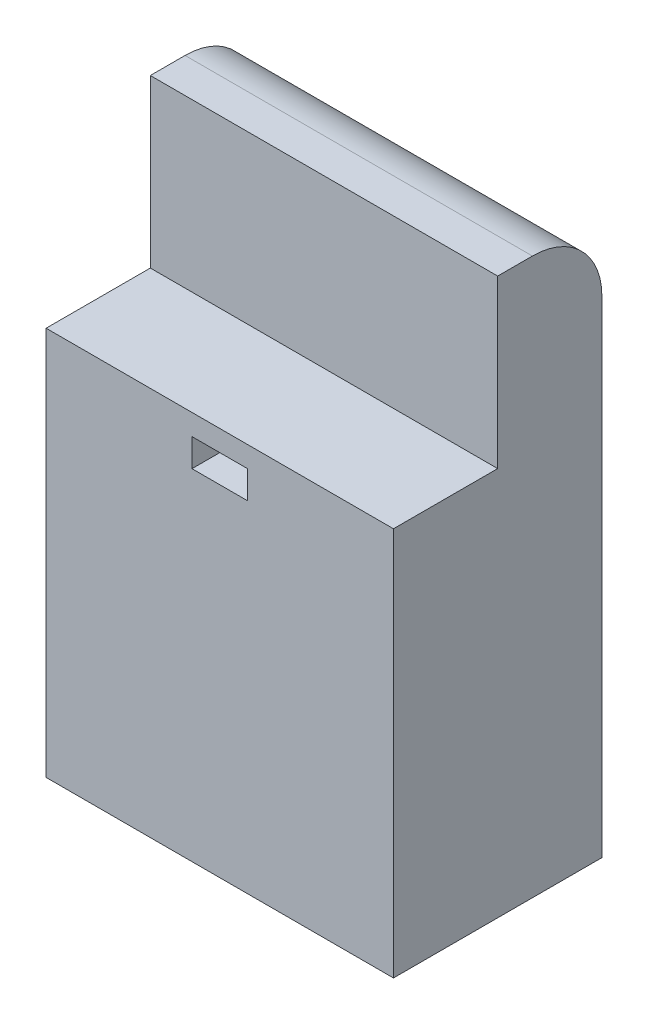
ISO-10303-21;
HEADER;
FILE_DESCRIPTION(('STEP AP214'),'2;1');
FILE_NAME('part.step','',(''),(''),'','','');
FILE_SCHEMA(('AUTOMOTIVE_DESIGN { 1 0 10303 214 1 1 1 1 }'));
ENDSEC;
DATA;
#1=APPLICATION_CONTEXT('core data for automotive mechanical design processes');
#2=APPLICATION_PROTOCOL_DEFINITION('international standard','automotive_design',2000,#1);
#3=PRODUCT_CONTEXT('',#1,'mechanical');
#4=PRODUCT('Part','Part','',(#3));
#5=PRODUCT_RELATED_PRODUCT_CATEGORY('part','',(#4));
#6=PRODUCT_DEFINITION_FORMATION('','',#4);
#7=PRODUCT_DEFINITION_CONTEXT('part definition',#1,'design');
#8=PRODUCT_DEFINITION('design','',#6,#7);
#9=PRODUCT_DEFINITION_SHAPE('','',#8);
#10=(LENGTH_UNIT() NAMED_UNIT(*) SI_UNIT(.MILLI.,.METRE.));
#11=(NAMED_UNIT(*) PLANE_ANGLE_UNIT() SI_UNIT($,.RADIAN.));
#12=(NAMED_UNIT(*) SI_UNIT($,.STERADIAN.) SOLID_ANGLE_UNIT());
#13=UNCERTAINTY_MEASURE_WITH_UNIT(LENGTH_MEASURE(1.E-05),#10,'distance_accuracy_value','');
#14=(GEOMETRIC_REPRESENTATION_CONTEXT(3) GLOBAL_UNCERTAINTY_ASSIGNED_CONTEXT((#13)) GLOBAL_UNIT_ASSIGNED_CONTEXT((#10,
#11,#12)) REPRESENTATION_CONTEXT('',''));
#15=CARTESIAN_POINT('',(0.,0.,0.));
#16=DIRECTION('',(0.,0.,1.));
#17=DIRECTION('',(1.,0.,0.));
#18=AXIS2_PLACEMENT_3D('',#15,#16,#17);
#19=CARTESIAN_POINT('',(-12.5,40.,7.5));
#20=DIRECTION('',(1.,0.,0.));
#21=DIRECTION('',(0.,0.,-1.));
#22=AXIS2_PLACEMENT_3D('',#19,#20,#21);
#23=PLANE('',#22);
#24=DIRECTION('',(0.,0.,1.));
#25=VECTOR('',#24,1.);
#26=CARTESIAN_POINT('',(-12.5,40.,7.5));
#27=LINE('',#26,#25);
#28=CARTESIAN_POINT('',(-12.5,40.,-2.49999999999999));
#29=VERTEX_POINT('',#28);
#30=CARTESIAN_POINT('',(-12.5,40.,0.));
#31=VERTEX_POINT('',#30);
#32=EDGE_CURVE('E175',#29,#31,#27,.T.);
#33=ORIENTED_EDGE('',*,*,#32,.F.);
#34=CARTESIAN_POINT('',(-12.5,35.,-2.49999999999999));
#35=DIRECTION('',(1.,0.,0.));
#36=DIRECTION('',(0.,0.,-1.));
#37=AXIS2_PLACEMENT_3D('',#34,#35,#36);
#38=CIRCLE('',#37,5.);
#39=CARTESIAN_POINT('',(-12.5,35.,-7.49999999999999));
#40=VERTEX_POINT('',#39);
#41=EDGE_CURVE('E202',#29,#40,#38,.F.);
#42=ORIENTED_EDGE('',*,*,#41,.T.);
#43=DIRECTION('',(0.,-1.,0.));
#44=VECTOR('',#43,1.);
#45=CARTESIAN_POINT('',(-12.5,40.,-7.49999999999999));
#46=LINE('',#45,#44);
#47=CARTESIAN_POINT('',(-12.5,0.,-7.49999999999999));
#48=VERTEX_POINT('',#47);
#49=EDGE_CURVE('E181',#40,#48,#46,.T.);
#50=ORIENTED_EDGE('',*,*,#49,.T.);
#51=DIRECTION('',(0.,0.,1.));
#52=VECTOR('',#51,1.);
#53=CARTESIAN_POINT('',(-12.5,0.,7.5));
#54=LINE('',#53,#52);
#55=CARTESIAN_POINT('',(-12.5,0.,7.5));
#56=VERTEX_POINT('',#55);
#57=EDGE_CURVE('E173',#48,#56,#54,.T.);
#58=ORIENTED_EDGE('',*,*,#57,.T.);
#59=DIRECTION('',(0.,-1.,0.));
#60=VECTOR('',#59,1.);
#61=CARTESIAN_POINT('',(-12.5,40.,7.5));
#62=LINE('',#61,#60);
#63=CARTESIAN_POINT('',(-12.5,28.,7.5));
#64=VERTEX_POINT('',#63);
#65=EDGE_CURVE('E197',#64,#56,#62,.T.);
#66=ORIENTED_EDGE('',*,*,#65,.F.);
#67=DIRECTION('',(0.,0.,1.));
#68=VECTOR('',#67,1.);
#69=CARTESIAN_POINT('',(-12.5,28.,7.5));
#70=LINE('',#69,#68);
#71=CARTESIAN_POINT('',(-12.5,28.,0.));
#72=VERTEX_POINT('',#71);
#73=EDGE_CURVE('E158',#72,#64,#70,.T.);
#74=ORIENTED_EDGE('',*,*,#73,.F.);
#75=DIRECTION('',(0.,1.,0.));
#76=VECTOR('',#75,1.);
#77=CARTESIAN_POINT('',(-12.5,28.,0.));
#78=LINE('',#77,#76);
#79=EDGE_CURVE('E170',#72,#31,#78,.T.);
#80=ORIENTED_EDGE('',*,*,#79,.T.);
#81=EDGE_LOOP('',(#33,#42,#50,#58,#66,#74,#80));
#82=FACE_BOUND('',#81,.T.);
#83=ADVANCED_FACE('F39',(#82),#23,.F.);
#84=CARTESIAN_POINT('',(12.5,40.,7.5));
#85=DIRECTION('',(0.,0.,-1.));
#86=DIRECTION('',(-1.,0.,0.));
#87=AXIS2_PLACEMENT_3D('',#84,#85,#86);
#88=PLANE('',#87);
#89=DIRECTION('',(-1.,0.,0.));
#90=VECTOR('',#89,1.);
#91=CARTESIAN_POINT('',(-2.,26.4947202356065,7.5));
#92=LINE('',#91,#90);
#93=CARTESIAN_POINT('',(2.,26.4947202356065,7.5));
#94=VERTEX_POINT('',#93);
#95=CARTESIAN_POINT('',(-2.,26.4947202356065,7.5));
#96=VERTEX_POINT('',#95);
#97=EDGE_CURVE('E148',#94,#96,#92,.T.);
#98=ORIENTED_EDGE('',*,*,#97,.F.);
#99=DIRECTION('',(0.,1.,0.));
#100=VECTOR('',#99,1.);
#101=CARTESIAN_POINT('',(2.,24.4947202356065,7.5));
#102=LINE('',#101,#100);
#103=CARTESIAN_POINT('',(2.,24.4947202356065,7.5));
#104=VERTEX_POINT('',#103);
#105=EDGE_CURVE('E54',#104,#94,#102,.T.);
#106=ORIENTED_EDGE('',*,*,#105,.F.);
#107=DIRECTION('',(1.,0.,0.));
#108=VECTOR('',#107,1.);
#109=CARTESIAN_POINT('',(-2.,24.4947202356065,7.5));
#110=LINE('',#109,#108);
#111=CARTESIAN_POINT('',(-2.,24.4947202356065,7.5));
#112=VERTEX_POINT('',#111);
#113=EDGE_CURVE('E139',#112,#104,#110,.T.);
#114=ORIENTED_EDGE('',*,*,#113,.F.);
#115=DIRECTION('',(0.,-1.,0.));
#116=VECTOR('',#115,1.);
#117=CARTESIAN_POINT('',(-2.,24.4947202356065,7.5));
#118=LINE('',#117,#116);
#119=EDGE_CURVE('E142',#96,#112,#118,.T.);
#120=ORIENTED_EDGE('',*,*,#119,.F.);
#121=EDGE_LOOP('',(#98,#106,#114,#120));
#122=FACE_BOUND('',#121,.T.);
#123=DIRECTION('',(0.,-1.,0.));
#124=VECTOR('',#123,1.);
#125=CARTESIAN_POINT('',(12.5,40.,7.5));
#126=LINE('',#125,#124);
#127=CARTESIAN_POINT('',(12.5,28.,7.5));
#128=VERTEX_POINT('',#127);
#129=CARTESIAN_POINT('',(12.5,0.,7.5));
#130=VERTEX_POINT('',#129);
#131=EDGE_CURVE('E195',#128,#130,#126,.T.);
#132=ORIENTED_EDGE('',*,*,#131,.F.);
#133=DIRECTION('',(1.,0.,0.));
#134=VECTOR('',#133,1.);
#135=CARTESIAN_POINT('',(-12.5,28.,7.5));
#136=LINE('',#135,#134);
#137=EDGE_CURVE('E160',#64,#128,#136,.T.);
#138=ORIENTED_EDGE('',*,*,#137,.F.);
#139=ORIENTED_EDGE('',*,*,#65,.T.);
#140=DIRECTION('',(1.,0.,0.));
#141=VECTOR('',#140,1.);
#142=CARTESIAN_POINT('',(12.5,0.,7.5));
#143=LINE('',#142,#141);
#144=EDGE_CURVE('E184',#56,#130,#143,.T.);
#145=ORIENTED_EDGE('',*,*,#144,.T.);
#146=EDGE_LOOP('',(#132,#138,#139,#145));
#147=FACE_BOUND('',#146,.T.);
#148=ADVANCED_FACE('F231',(#122,#147),#88,.F.);
#149=CARTESIAN_POINT('',(12.5,40.,7.5));
#150=DIRECTION('',(-1.,0.,0.));
#151=DIRECTION('',(0.,0.,1.));
#152=AXIS2_PLACEMENT_3D('',#149,#150,#151);
#153=PLANE('',#152);
#154=DIRECTION('',(0.,-1.,0.));
#155=VECTOR('',#154,1.);
#156=CARTESIAN_POINT('',(12.5,40.,-7.5));
#157=LINE('',#156,#155);
#158=CARTESIAN_POINT('',(12.5,35.,-7.5));
#159=VERTEX_POINT('',#158);
#160=CARTESIAN_POINT('',(12.5,0.,-7.5));
#161=VERTEX_POINT('',#160);
#162=EDGE_CURVE('E193',#159,#161,#157,.T.);
#163=ORIENTED_EDGE('',*,*,#162,.F.);
#164=CARTESIAN_POINT('',(12.5,35.,-2.5));
#165=DIRECTION('',(-1.,0.,0.));
#166=DIRECTION('',(0.,0.,1.));
#167=AXIS2_PLACEMENT_3D('',#164,#165,#166);
#168=CIRCLE('',#167,5.);
#169=CARTESIAN_POINT('',(12.5,40.,-2.5));
#170=VERTEX_POINT('',#169);
#171=EDGE_CURVE('E11',#159,#170,#168,.F.);
#172=ORIENTED_EDGE('',*,*,#171,.T.);
#173=DIRECTION('',(0.,0.,-1.));
#174=VECTOR('',#173,1.);
#175=CARTESIAN_POINT('',(12.5,40.,7.5));
#176=LINE('',#175,#174);
#177=CARTESIAN_POINT('',(12.5,40.,0.));
#178=VERTEX_POINT('',#177);
#179=EDGE_CURVE('E177',#178,#170,#176,.T.);
#180=ORIENTED_EDGE('',*,*,#179,.F.);
#181=DIRECTION('',(0.,1.,0.));
#182=VECTOR('',#181,1.);
#183=CARTESIAN_POINT('',(12.5,28.,0.));
#184=LINE('',#183,#182);
#185=CARTESIAN_POINT('',(12.5,28.,0.));
#186=VERTEX_POINT('',#185);
#187=EDGE_CURVE('E167',#186,#178,#184,.T.);
#188=ORIENTED_EDGE('',*,*,#187,.F.);
#189=DIRECTION('',(0.,0.,-1.));
#190=VECTOR('',#189,1.);
#191=CARTESIAN_POINT('',(12.5,28.,7.5));
#192=LINE('',#191,#190);
#193=EDGE_CURVE('E162',#128,#186,#192,.T.);
#194=ORIENTED_EDGE('',*,*,#193,.F.);
#195=ORIENTED_EDGE('',*,*,#131,.T.);
#196=DIRECTION('',(0.,0.,-1.));
#197=VECTOR('',#196,1.);
#198=CARTESIAN_POINT('',(12.5,0.,7.5));
#199=LINE('',#198,#197);
#200=EDGE_CURVE('E187',#130,#161,#199,.T.);
#201=ORIENTED_EDGE('',*,*,#200,.T.);
#202=EDGE_LOOP('',(#163,#172,#180,#188,#194,#195,#201));
#203=FACE_BOUND('',#202,.T.);
#204=ADVANCED_FACE('F209',(#203),#153,.F.);
#205=CARTESIAN_POINT('',(12.5,40.,-7.5));
#206=DIRECTION('',(0.,0.,1.));
#207=DIRECTION('',(1.,0.,0.));
#208=AXIS2_PLACEMENT_3D('',#205,#206,#207);
#209=PLANE('',#208);
#210=DIRECTION('',(1.,0.,0.));
#211=VECTOR('',#210,1.);
#212=CARTESIAN_POINT('',(-2.,24.4947202356065,-7.5));
#213=LINE('',#212,#211);
#214=CARTESIAN_POINT('',(-2.,24.4947202356065,-7.5));
#215=VERTEX_POINT('',#214);
#216=CARTESIAN_POINT('',(2.,24.4947202356065,-7.5));
#217=VERTEX_POINT('',#216);
#218=EDGE_CURVE('E129',#215,#217,#213,.T.);
#219=ORIENTED_EDGE('',*,*,#218,.T.);
#220=DIRECTION('',(0.,1.,0.));
#221=VECTOR('',#220,1.);
#222=CARTESIAN_POINT('',(2.,24.4947202356065,-7.5));
#223=LINE('',#222,#221);
#224=CARTESIAN_POINT('',(2.,26.4947202356065,-7.5));
#225=VERTEX_POINT('',#224);
#226=EDGE_CURVE('E123',#217,#225,#223,.T.);
#227=ORIENTED_EDGE('',*,*,#226,.T.);
#228=DIRECTION('',(-1.,0.,0.));
#229=VECTOR('',#228,1.);
#230=CARTESIAN_POINT('',(-2.,26.4947202356065,-7.5));
#231=LINE('',#230,#229);
#232=CARTESIAN_POINT('',(-2.,26.4947202356065,-7.5));
#233=VERTEX_POINT('',#232);
#234=EDGE_CURVE('E132',#225,#233,#231,.T.);
#235=ORIENTED_EDGE('',*,*,#234,.T.);
#236=DIRECTION('',(0.,-1.,0.));
#237=VECTOR('',#236,1.);
#238=CARTESIAN_POINT('',(-2.,24.4947202356065,-7.5));
#239=LINE('',#238,#237);
#240=EDGE_CURVE('E62',#233,#215,#239,.T.);
#241=ORIENTED_EDGE('',*,*,#240,.T.);
#242=EDGE_LOOP('',(#219,#227,#235,#241));
#243=FACE_BOUND('',#242,.T.);
#244=ORIENTED_EDGE('',*,*,#49,.F.);
#245=DIRECTION('',(-1.,0.,0.));
#246=VECTOR('',#245,1.);
#247=CARTESIAN_POINT('',(12.5,35.,-7.5));
#248=LINE('',#247,#246);
#249=EDGE_CURVE('E47',#40,#159,#248,.F.);
#250=ORIENTED_EDGE('',*,*,#249,.T.);
#251=ORIENTED_EDGE('',*,*,#162,.T.);
#252=DIRECTION('',(-1.,0.,0.));
#253=VECTOR('',#252,1.);
#254=CARTESIAN_POINT('',(12.5,0.,-7.5));
#255=LINE('',#254,#253);
#256=EDGE_CURVE('E178',#161,#48,#255,.T.);
#257=ORIENTED_EDGE('',*,*,#256,.T.);
#258=EDGE_LOOP('',(#244,#250,#251,#257));
#259=FACE_BOUND('',#258,.T.);
#260=ADVANCED_FACE('F136',(#243,#259),#209,.F.);
#261=CARTESIAN_POINT('',(0.,40.,0.));
#262=DIRECTION('',(0.,1.,0.));
#263=DIRECTION('',(0.,0.,1.));
#264=AXIS2_PLACEMENT_3D('',#261,#262,#263);
#265=PLANE('',#264);
#266=ORIENTED_EDGE('',*,*,#179,.T.);
#267=DIRECTION('',(-1.,0.,0.));
#268=VECTOR('',#267,1.);
#269=CARTESIAN_POINT('',(-12.5,40.,-2.49999999999999));
#270=LINE('',#269,#268);
#271=EDGE_CURVE('E199',#170,#29,#270,.T.);
#272=ORIENTED_EDGE('',*,*,#271,.T.);
#273=ORIENTED_EDGE('',*,*,#32,.T.);
#274=DIRECTION('',(-1.,0.,0.));
#275=VECTOR('',#274,1.);
#276=CARTESIAN_POINT('',(-12.5,40.,0.));
#277=LINE('',#276,#275);
#278=EDGE_CURVE('E154',#178,#31,#277,.T.);
#279=ORIENTED_EDGE('',*,*,#278,.F.);
#280=EDGE_LOOP('',(#266,#272,#273,#279));
#281=FACE_BOUND('',#280,.T.);
#282=ADVANCED_FACE('F216',(#281),#265,.T.);
#283=CARTESIAN_POINT('',(0.,0.,0.));
#284=DIRECTION('',(0.,1.,0.));
#285=DIRECTION('',(0.,0.,1.));
#286=AXIS2_PLACEMENT_3D('',#283,#284,#285);
#287=PLANE('',#286);
#288=ORIENTED_EDGE('',*,*,#57,.F.);
#289=ORIENTED_EDGE('',*,*,#256,.F.);
#290=ORIENTED_EDGE('',*,*,#200,.F.);
#291=ORIENTED_EDGE('',*,*,#144,.F.);
#292=EDGE_LOOP('',(#288,#289,#290,#291));
#293=FACE_BOUND('',#292,.T.);
#294=ADVANCED_FACE('F235',(#293),#287,.F.);
#295=CARTESIAN_POINT('',(-12.5,28.,0.));
#296=DIRECTION('',(0.,0.,-1.));
#297=DIRECTION('',(-1.,0.,0.));
#298=AXIS2_PLACEMENT_3D('',#295,#296,#297);
#299=PLANE('',#298);
#300=ORIENTED_EDGE('',*,*,#278,.T.);
#301=ORIENTED_EDGE('',*,*,#79,.F.);
#302=DIRECTION('',(-1.,0.,0.));
#303=VECTOR('',#302,1.);
#304=CARTESIAN_POINT('',(-12.5,28.,0.));
#305=LINE('',#304,#303);
#306=EDGE_CURVE('E164',#186,#72,#305,.T.);
#307=ORIENTED_EDGE('',*,*,#306,.F.);
#308=ORIENTED_EDGE('',*,*,#187,.T.);
#309=EDGE_LOOP('',(#300,#301,#307,#308));
#310=FACE_BOUND('',#309,.T.);
#311=ADVANCED_FACE('F223',(#310),#299,.F.);
#312=CARTESIAN_POINT('',(0.,28.,0.));
#313=DIRECTION('',(0.,-1.,0.));
#314=DIRECTION('',(0.,0.,-1.));
#315=AXIS2_PLACEMENT_3D('',#312,#313,#314);
#316=PLANE('',#315);
#317=ORIENTED_EDGE('',*,*,#73,.T.);
#318=ORIENTED_EDGE('',*,*,#137,.T.);
#319=ORIENTED_EDGE('',*,*,#193,.T.);
#320=ORIENTED_EDGE('',*,*,#306,.T.);
#321=EDGE_LOOP('',(#317,#318,#319,#320));
#322=FACE_BOUND('',#321,.T.);
#323=ADVANCED_FACE('F226',(#322),#316,.F.);
#324=CARTESIAN_POINT('',(0.,35.,-2.5));
#325=DIRECTION('',(1.,0.,0.));
#326=DIRECTION('',(0.,0.,-1.));
#327=AXIS2_PLACEMENT_3D('',#324,#325,#326);
#328=CYLINDRICAL_SURFACE('',#327,5.);
#329=ORIENTED_EDGE('',*,*,#171,.F.);
#330=ORIENTED_EDGE('',*,*,#249,.F.);
#331=ORIENTED_EDGE('',*,*,#41,.F.);
#332=ORIENTED_EDGE('',*,*,#271,.F.);
#333=EDGE_LOOP('',(#329,#330,#331,#332));
#334=FACE_BOUND('',#333,.T.);
#335=ADVANCED_FACE('F41',(#334),#328,.T.);
#336=CARTESIAN_POINT('',(2.,24.4947202356065,-7.5));
#337=DIRECTION('',(1.,0.,0.));
#338=DIRECTION('',(0.,0.,-1.));
#339=AXIS2_PLACEMENT_3D('',#336,#337,#338);
#340=PLANE('',#339);
#341=ORIENTED_EDGE('',*,*,#105,.T.);
#342=DIRECTION('',(0.,0.,1.));
#343=VECTOR('',#342,1.);
#344=CARTESIAN_POINT('',(2.,26.4947202356065,-7.5));
#345=LINE('',#344,#343);
#346=EDGE_CURVE('E119',#225,#94,#345,.T.);
#347=ORIENTED_EDGE('',*,*,#346,.F.);
#348=ORIENTED_EDGE('',*,*,#226,.F.);
#349=DIRECTION('',(0.,0.,1.));
#350=VECTOR('',#349,1.);
#351=CARTESIAN_POINT('',(2.,24.4947202356065,-7.5));
#352=LINE('',#351,#350);
#353=EDGE_CURVE('E152',#217,#104,#352,.T.);
#354=ORIENTED_EDGE('',*,*,#353,.T.);
#355=EDGE_LOOP('',(#341,#347,#348,#354));
#356=FACE_BOUND('',#355,.T.);
#357=ADVANCED_FACE('F121',(#356),#340,.F.);
#358=CARTESIAN_POINT('',(-2.,24.4947202356065,-7.5));
#359=DIRECTION('',(0.,-1.,0.));
#360=DIRECTION('',(0.,0.,-1.));
#361=AXIS2_PLACEMENT_3D('',#358,#359,#360);
#362=PLANE('',#361);
#363=ORIENTED_EDGE('',*,*,#113,.T.);
#364=ORIENTED_EDGE('',*,*,#353,.F.);
#365=ORIENTED_EDGE('',*,*,#218,.F.);
#366=DIRECTION('',(0.,0.,1.));
#367=VECTOR('',#366,1.);
#368=CARTESIAN_POINT('',(-2.,24.4947202356065,-7.5));
#369=LINE('',#368,#367);
#370=EDGE_CURVE('E155',#215,#112,#369,.T.);
#371=ORIENTED_EDGE('',*,*,#370,.T.);
#372=EDGE_LOOP('',(#363,#364,#365,#371));
#373=FACE_BOUND('',#372,.T.);
#374=ADVANCED_FACE('F269',(#373),#362,.F.);
#375=CARTESIAN_POINT('',(-2.,24.4947202356065,-7.5));
#376=DIRECTION('',(-1.,0.,0.));
#377=DIRECTION('',(0.,0.,1.));
#378=AXIS2_PLACEMENT_3D('',#375,#376,#377);
#379=PLANE('',#378);
#380=ORIENTED_EDGE('',*,*,#119,.T.);
#381=ORIENTED_EDGE('',*,*,#370,.F.);
#382=ORIENTED_EDGE('',*,*,#240,.F.);
#383=DIRECTION('',(0.,0.,1.));
#384=VECTOR('',#383,1.);
#385=CARTESIAN_POINT('',(-2.,26.4947202356065,-7.5));
#386=LINE('',#385,#384);
#387=EDGE_CURVE('E128',#233,#96,#386,.T.);
#388=ORIENTED_EDGE('',*,*,#387,.T.);
#389=EDGE_LOOP('',(#380,#381,#382,#388));
#390=FACE_BOUND('',#389,.T.);
#391=ADVANCED_FACE('F278',(#390),#379,.F.);
#392=CARTESIAN_POINT('',(-2.,26.4947202356065,-7.5));
#393=DIRECTION('',(0.,1.,0.));
#394=DIRECTION('',(0.,0.,1.));
#395=AXIS2_PLACEMENT_3D('',#392,#393,#394);
#396=PLANE('',#395);
#397=ORIENTED_EDGE('',*,*,#97,.T.);
#398=ORIENTED_EDGE('',*,*,#387,.F.);
#399=ORIENTED_EDGE('',*,*,#234,.F.);
#400=ORIENTED_EDGE('',*,*,#346,.T.);
#401=EDGE_LOOP('',(#397,#398,#399,#400));
#402=FACE_BOUND('',#401,.T.);
#403=ADVANCED_FACE('F133',(#402),#396,.F.);
#404=CLOSED_SHELL('',(#83,#148,#204,#260,#282,#294,#311,#323,#335,#357,#374,#391,#403));
#405=MANIFOLD_SOLID_BREP('B2',#404);
#406=ADVANCED_BREP_SHAPE_REPRESENTATION('',(#18,#405),#14);
#407=SHAPE_DEFINITION_REPRESENTATION(#9,#406);
ENDSEC;
END-ISO-10303-21;
